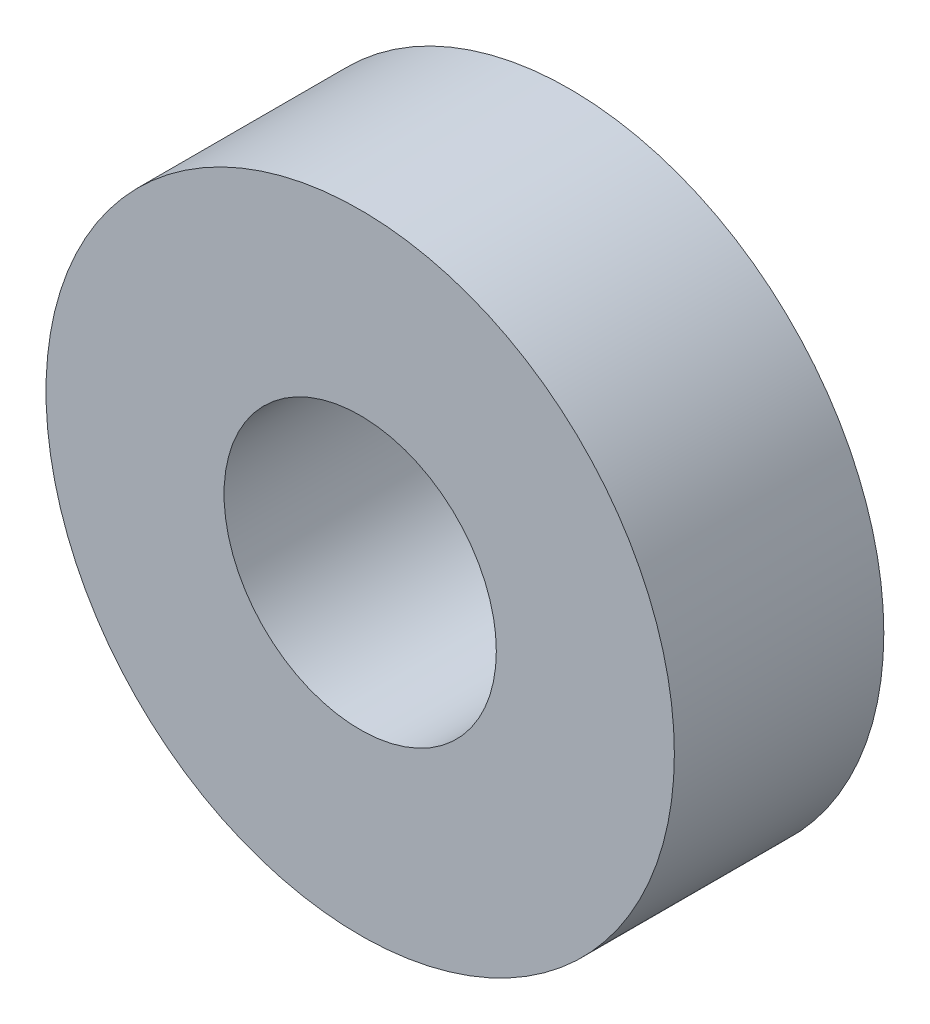
ISO-10303-21;
HEADER;
FILE_DESCRIPTION(('STEP AP214'),'2;1');
FILE_NAME('part.step','',(''),(''),'','','');
FILE_SCHEMA(('AUTOMOTIVE_DESIGN { 1 0 10303 214 1 1 1 1 }'));
ENDSEC;
DATA;
#1=APPLICATION_CONTEXT('core data for automotive mechanical design processes');
#2=APPLICATION_PROTOCOL_DEFINITION('international standard','automotive_design',2000,#1);
#3=PRODUCT_CONTEXT('',#1,'mechanical');
#4=PRODUCT('Part','Part','',(#3));
#5=PRODUCT_RELATED_PRODUCT_CATEGORY('part','',(#4));
#6=PRODUCT_DEFINITION_FORMATION('','',#4);
#7=PRODUCT_DEFINITION_CONTEXT('part definition',#1,'design');
#8=PRODUCT_DEFINITION('design','',#6,#7);
#9=PRODUCT_DEFINITION_SHAPE('','',#8);
#10=(LENGTH_UNIT() NAMED_UNIT(*) SI_UNIT(.MILLI.,.METRE.));
#11=(NAMED_UNIT(*) PLANE_ANGLE_UNIT() SI_UNIT($,.RADIAN.));
#12=(NAMED_UNIT(*) SI_UNIT($,.STERADIAN.) SOLID_ANGLE_UNIT());
#13=UNCERTAINTY_MEASURE_WITH_UNIT(LENGTH_MEASURE(1.E-05),#10,'distance_accuracy_value','');
#14=(GEOMETRIC_REPRESENTATION_CONTEXT(3) GLOBAL_UNCERTAINTY_ASSIGNED_CONTEXT((#13)) GLOBAL_UNIT_ASSIGNED_CONTEXT((#10,
#11,#12)) REPRESENTATION_CONTEXT('',''));
#15=CARTESIAN_POINT('',(0.,0.,0.));
#16=DIRECTION('',(0.,0.,1.));
#17=DIRECTION('',(1.,0.,0.));
#18=AXIS2_PLACEMENT_3D('',#15,#16,#17);
#19=CARTESIAN_POINT('',(0.,0.,5.));
#20=DIRECTION('',(0.,0.,1.));
#21=DIRECTION('',(1.,0.,0.));
#22=AXIS2_PLACEMENT_3D('',#19,#20,#21);
#23=PLANE('',#22);
#24=CARTESIAN_POINT('',(0.,0.,5.));
#25=DIRECTION('',(0.,0.,1.));
#26=DIRECTION('',(1.,0.,0.));
#27=AXIS2_PLACEMENT_3D('',#24,#25,#26);
#28=CIRCLE('',#27,7.5);
#29=CARTESIAN_POINT('',(7.5,0.,5.));
#30=VERTEX_POINT('',#29);
#31=EDGE_CURVE('E10',#30,#30,#28,.T.);
#32=ORIENTED_EDGE('',*,*,#31,.T.);
#33=EDGE_LOOP('',(#32));
#34=FACE_BOUND('',#33,.T.);
#35=CARTESIAN_POINT('',(0.,0.,5.));
#36=DIRECTION('',(0.,0.,1.));
#37=DIRECTION('',(1.,0.,0.));
#38=AXIS2_PLACEMENT_3D('',#35,#36,#37);
#39=CIRCLE('',#38,3.25);
#40=CARTESIAN_POINT('',(3.25,0.,5.));
#41=VERTEX_POINT('',#40);
#42=EDGE_CURVE('E44',#41,#41,#39,.T.);
#43=ORIENTED_EDGE('',*,*,#42,.F.);
#44=EDGE_LOOP('',(#43));
#45=FACE_BOUND('',#44,.T.);
#46=ADVANCED_FACE('F33',(#34,#45),#23,.T.);
#47=CARTESIAN_POINT('',(0.,0.,0.));
#48=DIRECTION('',(0.,0.,1.));
#49=DIRECTION('',(1.,0.,0.));
#50=AXIS2_PLACEMENT_3D('',#47,#48,#49);
#51=PLANE('',#50);
#52=CARTESIAN_POINT('',(0.,0.,0.));
#53=DIRECTION('',(0.,0.,1.));
#54=DIRECTION('',(1.,0.,0.));
#55=AXIS2_PLACEMENT_3D('',#52,#53,#54);
#56=CIRCLE('',#55,7.5);
#57=CARTESIAN_POINT('',(7.5,0.,0.));
#58=VERTEX_POINT('',#57);
#59=EDGE_CURVE('E37',#58,#58,#56,.T.);
#60=ORIENTED_EDGE('',*,*,#59,.F.);
#61=EDGE_LOOP('',(#60));
#62=FACE_BOUND('',#61,.T.);
#63=CARTESIAN_POINT('',(0.,0.,0.));
#64=DIRECTION('',(0.,0.,1.));
#65=DIRECTION('',(1.,0.,0.));
#66=AXIS2_PLACEMENT_3D('',#63,#64,#65);
#67=CIRCLE('',#66,3.25);
#68=CARTESIAN_POINT('',(3.25,0.,0.));
#69=VERTEX_POINT('',#68);
#70=EDGE_CURVE('E46',#69,#69,#67,.T.);
#71=ORIENTED_EDGE('',*,*,#70,.T.);
#72=EDGE_LOOP('',(#71));
#73=FACE_BOUND('',#72,.T.);
#74=ADVANCED_FACE('F56',(#62,#73),#51,.F.);
#75=CARTESIAN_POINT('',(0.,0.,5.));
#76=DIRECTION('',(0.,0.,-1.));
#77=DIRECTION('',(-1.,0.,0.));
#78=AXIS2_PLACEMENT_3D('',#75,#76,#77);
#79=CYLINDRICAL_SURFACE('',#78,7.5);
#80=ORIENTED_EDGE('',*,*,#31,.F.);
#81=EDGE_LOOP('',(#80));
#82=FACE_BOUND('',#81,.T.);
#83=ORIENTED_EDGE('',*,*,#59,.T.);
#84=EDGE_LOOP('',(#83));
#85=FACE_BOUND('',#84,.T.);
#86=ADVANCED_FACE('F35',(#82,#85),#79,.T.);
#87=CARTESIAN_POINT('',(0.,0.,5.));
#88=DIRECTION('',(0.,0.,-1.));
#89=DIRECTION('',(-1.,0.,0.));
#90=AXIS2_PLACEMENT_3D('',#87,#88,#89);
#91=CYLINDRICAL_SURFACE('',#90,3.25);
#92=ORIENTED_EDGE('',*,*,#42,.T.);
#93=EDGE_LOOP('',(#92));
#94=FACE_BOUND('',#93,.T.);
#95=ORIENTED_EDGE('',*,*,#70,.F.);
#96=EDGE_LOOP('',(#95));
#97=FACE_BOUND('',#96,.T.);
#98=ADVANCED_FACE('F52',(#94,#97),#91,.F.);
#99=CLOSED_SHELL('',(#46,#74,#86,#98));
#100=MANIFOLD_SOLID_BREP('B2',#99);
#101=ADVANCED_BREP_SHAPE_REPRESENTATION('',(#18,#100),#14);
#102=SHAPE_DEFINITION_REPRESENTATION(#9,#101);
ENDSEC;
END-ISO-10303-21;
